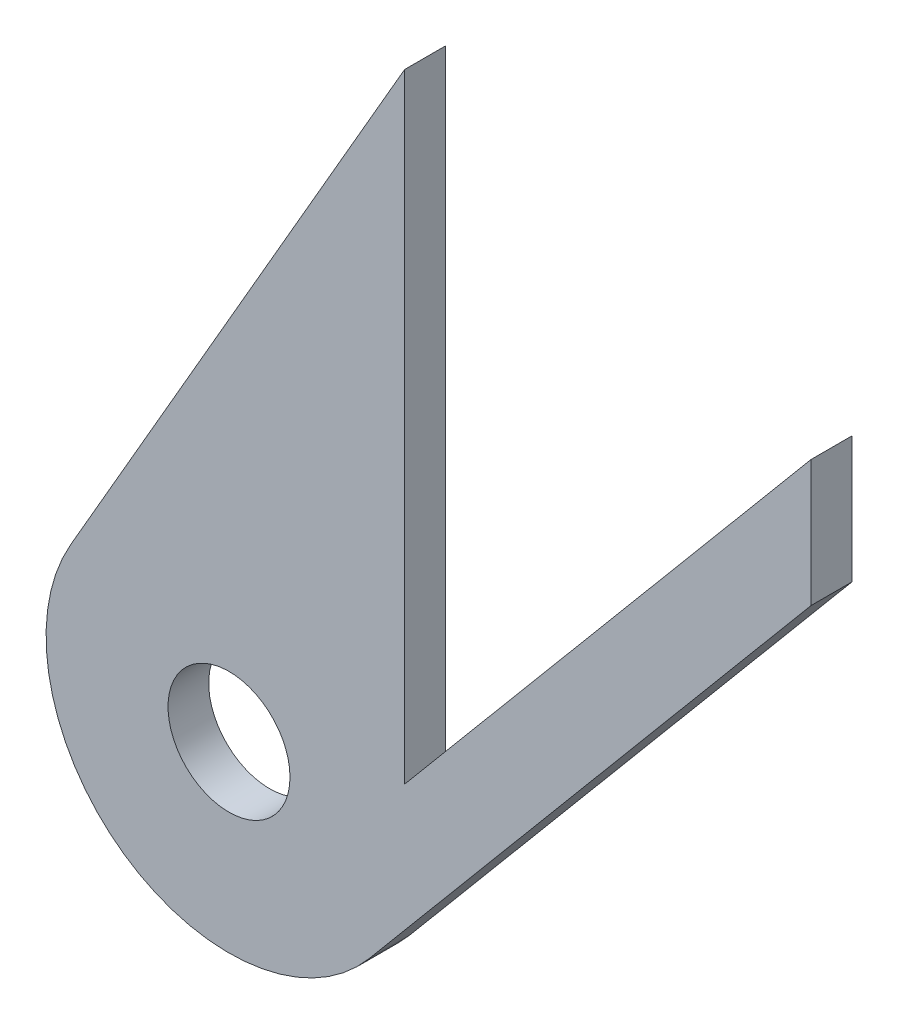
ISO-10303-21;
HEADER;
FILE_DESCRIPTION(('STEP AP214'),'2;1');
FILE_NAME('part.step','',(''),(''),'','','');
FILE_SCHEMA(('AUTOMOTIVE_DESIGN { 1 0 10303 214 1 1 1 1 }'));
ENDSEC;
DATA;
#1=APPLICATION_CONTEXT('core data for automotive mechanical design processes');
#2=APPLICATION_PROTOCOL_DEFINITION('international standard','automotive_design',2000,#1);
#3=PRODUCT_CONTEXT('',#1,'mechanical');
#4=PRODUCT('Part','Part','',(#3));
#5=PRODUCT_RELATED_PRODUCT_CATEGORY('part','',(#4));
#6=PRODUCT_DEFINITION_FORMATION('','',#4);
#7=PRODUCT_DEFINITION_CONTEXT('part definition',#1,'design');
#8=PRODUCT_DEFINITION('design','',#6,#7);
#9=PRODUCT_DEFINITION_SHAPE('','',#8);
#10=(LENGTH_UNIT() NAMED_UNIT(*) SI_UNIT(.MILLI.,.METRE.));
#11=(NAMED_UNIT(*) PLANE_ANGLE_UNIT() SI_UNIT($,.RADIAN.));
#12=(NAMED_UNIT(*) SI_UNIT($,.STERADIAN.) SOLID_ANGLE_UNIT());
#13=UNCERTAINTY_MEASURE_WITH_UNIT(LENGTH_MEASURE(1.E-05),#10,'distance_accuracy_value','');
#14=(GEOMETRIC_REPRESENTATION_CONTEXT(3) GLOBAL_UNCERTAINTY_ASSIGNED_CONTEXT((#13)) GLOBAL_UNIT_ASSIGNED_CONTEXT((#10,
#11,#12)) REPRESENTATION_CONTEXT('',''));
#15=CARTESIAN_POINT('',(0.,0.,0.));
#16=DIRECTION('',(0.,0.,1.));
#17=DIRECTION('',(1.,0.,0.));
#18=AXIS2_PLACEMENT_3D('',#15,#16,#17);
#19=CARTESIAN_POINT('',(0.,0.,10.));
#20=DIRECTION('',(0.,0.,1.));
#21=DIRECTION('',(1.,0.,0.));
#22=AXIS2_PLACEMENT_3D('',#19,#20,#21);
#23=PLANE('',#22);
#24=DIRECTION('',(0.,1.,0.));
#25=VECTOR('',#24,1.);
#26=CARTESIAN_POINT('',(43.2020211570784,12.5930682497693,10.));
#27=LINE('',#26,#25);
#28=CARTESIAN_POINT('',(43.2020211570784,12.5930682497693,10.));
#29=VERTEX_POINT('',#28);
#30=CARTESIAN_POINT('',(43.2020211570784,164.828095633725,10.));
#31=VERTEX_POINT('',#30);
#32=EDGE_CURVE('E129',#29,#31,#27,.T.);
#33=ORIENTED_EDGE('',*,*,#32,.T.);
#34=DIRECTION('',(-0.5,-0.866025403784439,0.));
#35=VECTOR('',#34,1.);
#36=CARTESIAN_POINT('',(-38.9711431702997,22.5,10.));
#37=LINE('',#36,#35);
#38=CARTESIAN_POINT('',(-38.9711431702997,22.5,10.));
#39=VERTEX_POINT('',#38);
#40=EDGE_CURVE('E87',#31,#39,#37,.T.);
#41=ORIENTED_EDGE('',*,*,#40,.T.);
#42=CARTESIAN_POINT('',(0.,0.,10.));
#43=DIRECTION('',(0.,0.,1.));
#44=DIRECTION('',(1.,0.,0.));
#45=AXIS2_PLACEMENT_3D('',#42,#43,#44);
#46=CIRCLE('',#45,45.);
#47=CARTESIAN_POINT('',(34.4719999403542,-28.925442435894,10.));
#48=VERTEX_POINT('',#47);
#49=EDGE_CURVE('E100',#39,#48,#46,.T.);
#50=ORIENTED_EDGE('',*,*,#49,.T.);
#51=DIRECTION('',(0.642787609686535,0.766044443118982,0.));
#52=VECTOR('',#51,1.);
#53=CARTESIAN_POINT('',(34.4719999403542,-28.925442435894,10.));
#54=LINE('',#53,#52);
#55=CARTESIAN_POINT('',(143.202021157079,100.653950971983,10.));
#56=VERTEX_POINT('',#55);
#57=EDGE_CURVE('E94',#48,#56,#54,.T.);
#58=ORIENTED_EDGE('',*,*,#57,.T.);
#59=DIRECTION('',(0.,1.,0.));
#60=VECTOR('',#59,1.);
#61=CARTESIAN_POINT('',(143.202021157079,100.653950971983,10.));
#62=LINE('',#61,#60);
#63=CARTESIAN_POINT('',(143.202021157079,131.768427509192,10.));
#64=VERTEX_POINT('',#63);
#65=EDGE_CURVE('E98',#56,#64,#62,.T.);
#66=ORIENTED_EDGE('',*,*,#65,.T.);
#67=DIRECTION('',(-0.642787609686535,-0.766044443118982,0.));
#68=VECTOR('',#67,1.);
#69=CARTESIAN_POINT('',(143.202021157079,131.768427509192,10.));
#70=LINE('',#69,#68);
#71=EDGE_CURVE('E50',#64,#29,#70,.T.);
#72=ORIENTED_EDGE('',*,*,#71,.T.);
#73=EDGE_LOOP('',(#33,#41,#50,#58,#66,#72));
#74=FACE_BOUND('',#73,.T.);
#75=CARTESIAN_POINT('',(0.,0.,10.));
#76=DIRECTION('',(0.,0.,1.));
#77=DIRECTION('',(1.,0.,0.));
#78=AXIS2_PLACEMENT_3D('',#75,#76,#77);
#79=CIRCLE('',#78,15.);
#80=CARTESIAN_POINT('',(15.,0.,10.));
#81=VERTEX_POINT('',#80);
#82=EDGE_CURVE('E122',#81,#81,#79,.T.);
#83=ORIENTED_EDGE('',*,*,#82,.F.);
#84=EDGE_LOOP('',(#83));
#85=FACE_BOUND('',#84,.T.);
#86=ADVANCED_FACE('F33',(#74,#85),#23,.T.);
#87=CARTESIAN_POINT('',(0.,0.,0.));
#88=DIRECTION('',(0.,0.,1.));
#89=DIRECTION('',(1.,0.,0.));
#90=AXIS2_PLACEMENT_3D('',#87,#88,#89);
#91=PLANE('',#90);
#92=DIRECTION('',(0.,1.,0.));
#93=VECTOR('',#92,1.);
#94=CARTESIAN_POINT('',(43.2020211570784,12.5930682497693,0.));
#95=LINE('',#94,#93);
#96=CARTESIAN_POINT('',(43.2020211570784,12.5930682497693,0.));
#97=VERTEX_POINT('',#96);
#98=CARTESIAN_POINT('',(43.2020211570784,164.828095633725,0.));
#99=VERTEX_POINT('',#98);
#100=EDGE_CURVE('E118',#97,#99,#95,.T.);
#101=ORIENTED_EDGE('',*,*,#100,.F.);
#102=DIRECTION('',(-0.642787609686535,-0.766044443118982,0.));
#103=VECTOR('',#102,1.);
#104=CARTESIAN_POINT('',(143.202021157079,131.768427509192,0.));
#105=LINE('',#104,#103);
#106=CARTESIAN_POINT('',(143.202021157079,131.768427509192,0.));
#107=VERTEX_POINT('',#106);
#108=EDGE_CURVE('E79',#107,#97,#105,.T.);
#109=ORIENTED_EDGE('',*,*,#108,.F.);
#110=DIRECTION('',(0.,1.,0.));
#111=VECTOR('',#110,1.);
#112=CARTESIAN_POINT('',(143.202021157079,100.653950971983,0.));
#113=LINE('',#112,#111);
#114=CARTESIAN_POINT('',(143.202021157079,100.653950971983,0.));
#115=VERTEX_POINT('',#114);
#116=EDGE_CURVE('E73',#115,#107,#113,.T.);
#117=ORIENTED_EDGE('',*,*,#116,.F.);
#118=DIRECTION('',(0.642787609686535,0.766044443118982,0.));
#119=VECTOR('',#118,1.);
#120=CARTESIAN_POINT('',(34.4719999403542,-28.925442435894,0.));
#121=LINE('',#120,#119);
#122=CARTESIAN_POINT('',(34.4719999403542,-28.925442435894,0.));
#123=VERTEX_POINT('',#122);
#124=EDGE_CURVE('E108',#123,#115,#121,.T.);
#125=ORIENTED_EDGE('',*,*,#124,.F.);
#126=CARTESIAN_POINT('',(0.,0.,0.));
#127=DIRECTION('',(0.,0.,1.));
#128=DIRECTION('',(1.,0.,0.));
#129=AXIS2_PLACEMENT_3D('',#126,#127,#128);
#130=CIRCLE('',#129,45.);
#131=CARTESIAN_POINT('',(-38.9711431702997,22.5,0.));
#132=VERTEX_POINT('',#131);
#133=EDGE_CURVE('E124',#132,#123,#130,.T.);
#134=ORIENTED_EDGE('',*,*,#133,.F.);
#135=DIRECTION('',(-0.5,-0.866025403784439,0.));
#136=VECTOR('',#135,1.);
#137=CARTESIAN_POINT('',(-38.9711431702997,22.5,0.));
#138=LINE('',#137,#136);
#139=EDGE_CURVE('E121',#99,#132,#138,.T.);
#140=ORIENTED_EDGE('',*,*,#139,.F.);
#141=EDGE_LOOP('',(#101,#109,#117,#125,#134,#140));
#142=FACE_BOUND('',#141,.T.);
#143=CARTESIAN_POINT('',(0.,0.,0.));
#144=DIRECTION('',(0.,0.,1.));
#145=DIRECTION('',(1.,0.,0.));
#146=AXIS2_PLACEMENT_3D('',#143,#144,#145);
#147=CIRCLE('',#146,15.);
#148=CARTESIAN_POINT('',(15.,0.,0.));
#149=VERTEX_POINT('',#148);
#150=EDGE_CURVE('E222',#149,#149,#147,.T.);
#151=ORIENTED_EDGE('',*,*,#150,.T.);
#152=EDGE_LOOP('',(#151));
#153=FACE_BOUND('',#152,.T.);
#154=ADVANCED_FACE('F138',(#142,#153),#91,.F.);
#155=CARTESIAN_POINT('',(43.2020211570784,12.5930682497693,10.));
#156=DIRECTION('',(-1.,0.,0.));
#157=DIRECTION('',(0.,0.,1.));
#158=AXIS2_PLACEMENT_3D('',#155,#156,#157);
#159=PLANE('',#158);
#160=ORIENTED_EDGE('',*,*,#100,.T.);
#161=DIRECTION('',(0.,0.,-1.));
#162=VECTOR('',#161,1.);
#163=CARTESIAN_POINT('',(43.2020211570784,164.828095633725,10.));
#164=LINE('',#163,#162);
#165=EDGE_CURVE('E11',#31,#99,#164,.T.);
#166=ORIENTED_EDGE('',*,*,#165,.F.);
#167=ORIENTED_EDGE('',*,*,#32,.F.);
#168=DIRECTION('',(0.,0.,-1.));
#169=VECTOR('',#168,1.);
#170=CARTESIAN_POINT('',(43.2020211570784,12.5930682497693,10.));
#171=LINE('',#170,#169);
#172=EDGE_CURVE('E114',#29,#97,#171,.T.);
#173=ORIENTED_EDGE('',*,*,#172,.T.);
#174=EDGE_LOOP('',(#160,#166,#167,#173));
#175=FACE_BOUND('',#174,.T.);
#176=ADVANCED_FACE('F35',(#175),#159,.F.);
#177=CARTESIAN_POINT('',(-38.9711431702997,22.5,10.));
#178=DIRECTION('',(0.866025403784439,-0.5,0.));
#179=DIRECTION('',(0.5,0.866025403784439,0.));
#180=AXIS2_PLACEMENT_3D('',#177,#178,#179);
#181=PLANE('',#180);
#182=ORIENTED_EDGE('',*,*,#139,.T.);
#183=DIRECTION('',(0.,0.,-1.));
#184=VECTOR('',#183,1.);
#185=CARTESIAN_POINT('',(-38.9711431702997,22.5,10.));
#186=LINE('',#185,#184);
#187=EDGE_CURVE('E42',#39,#132,#186,.T.);
#188=ORIENTED_EDGE('',*,*,#187,.F.);
#189=ORIENTED_EDGE('',*,*,#40,.F.);
#190=ORIENTED_EDGE('',*,*,#165,.T.);
#191=EDGE_LOOP('',(#182,#188,#189,#190));
#192=FACE_BOUND('',#191,.T.);
#193=ADVANCED_FACE('F163',(#192),#181,.F.);
#194=CARTESIAN_POINT('',(0.,0.,10.));
#195=DIRECTION('',(0.,0.,-1.));
#196=DIRECTION('',(-1.,0.,0.));
#197=AXIS2_PLACEMENT_3D('',#194,#195,#196);
#198=CYLINDRICAL_SURFACE('',#197,45.);
#199=ORIENTED_EDGE('',*,*,#133,.T.);
#200=DIRECTION('',(0.,0.,-1.));
#201=VECTOR('',#200,1.);
#202=CARTESIAN_POINT('',(34.4719999403542,-28.925442435894,10.));
#203=LINE('',#202,#201);
#204=EDGE_CURVE('E109',#48,#123,#203,.T.);
#205=ORIENTED_EDGE('',*,*,#204,.F.);
#206=ORIENTED_EDGE('',*,*,#49,.F.);
#207=ORIENTED_EDGE('',*,*,#187,.T.);
#208=EDGE_LOOP('',(#199,#205,#206,#207));
#209=FACE_BOUND('',#208,.T.);
#210=ADVANCED_FACE('F135',(#209),#198,.T.);
#211=CARTESIAN_POINT('',(34.4719999403542,-28.925442435894,10.));
#212=DIRECTION('',(-0.766044443118982,0.642787609686535,0.));
#213=DIRECTION('',(-0.642787609686535,-0.766044443118982,0.));
#214=AXIS2_PLACEMENT_3D('',#211,#212,#213);
#215=PLANE('',#214);
#216=ORIENTED_EDGE('',*,*,#124,.T.);
#217=DIRECTION('',(0.,0.,-1.));
#218=VECTOR('',#217,1.);
#219=CARTESIAN_POINT('',(143.202021157079,100.653950971983,10.));
#220=LINE('',#219,#218);
#221=EDGE_CURVE('E105',#56,#115,#220,.T.);
#222=ORIENTED_EDGE('',*,*,#221,.F.);
#223=ORIENTED_EDGE('',*,*,#57,.F.);
#224=ORIENTED_EDGE('',*,*,#204,.T.);
#225=EDGE_LOOP('',(#216,#222,#223,#224));
#226=FACE_BOUND('',#225,.T.);
#227=ADVANCED_FACE('F106',(#226),#215,.F.);
#228=CARTESIAN_POINT('',(143.202021157079,100.653950971983,10.));
#229=DIRECTION('',(-1.,0.,0.));
#230=DIRECTION('',(0.,0.,1.));
#231=AXIS2_PLACEMENT_3D('',#228,#229,#230);
#232=PLANE('',#231);
#233=ORIENTED_EDGE('',*,*,#116,.T.);
#234=DIRECTION('',(0.,0.,-1.));
#235=VECTOR('',#234,1.);
#236=CARTESIAN_POINT('',(143.202021157079,131.768427509192,10.));
#237=LINE('',#236,#235);
#238=EDGE_CURVE('E110',#64,#107,#237,.T.);
#239=ORIENTED_EDGE('',*,*,#238,.F.);
#240=ORIENTED_EDGE('',*,*,#65,.F.);
#241=ORIENTED_EDGE('',*,*,#221,.T.);
#242=EDGE_LOOP('',(#233,#239,#240,#241));
#243=FACE_BOUND('',#242,.T.);
#244=ADVANCED_FACE('F112',(#243),#232,.F.);
#245=CARTESIAN_POINT('',(143.202021157079,131.768427509192,10.));
#246=DIRECTION('',(0.766044443118982,-0.642787609686535,0.));
#247=DIRECTION('',(0.642787609686535,0.766044443118982,0.));
#248=AXIS2_PLACEMENT_3D('',#245,#246,#247);
#249=PLANE('',#248);
#250=ORIENTED_EDGE('',*,*,#108,.T.);
#251=ORIENTED_EDGE('',*,*,#172,.F.);
#252=ORIENTED_EDGE('',*,*,#71,.F.);
#253=ORIENTED_EDGE('',*,*,#238,.T.);
#254=EDGE_LOOP('',(#250,#251,#252,#253));
#255=FACE_BOUND('',#254,.T.);
#256=ADVANCED_FACE('F143',(#255),#249,.F.);
#257=CARTESIAN_POINT('',(0.,0.,10.));
#258=DIRECTION('',(0.,0.,-1.));
#259=DIRECTION('',(-1.,0.,0.));
#260=AXIS2_PLACEMENT_3D('',#257,#258,#259);
#261=CYLINDRICAL_SURFACE('',#260,15.);
#262=ORIENTED_EDGE('',*,*,#82,.T.);
#263=EDGE_LOOP('',(#262));
#264=FACE_BOUND('',#263,.T.);
#265=ORIENTED_EDGE('',*,*,#150,.F.);
#266=EDGE_LOOP('',(#265));
#267=FACE_BOUND('',#266,.T.);
#268=ADVANCED_FACE('F145',(#264,#267),#261,.F.);
#269=CLOSED_SHELL('',(#86,#154,#176,#193,#210,#227,#244,#256,#268));
#270=MANIFOLD_SOLID_BREP('B2',#269);
#271=ADVANCED_BREP_SHAPE_REPRESENTATION('',(#18,#270),#14);
#272=SHAPE_DEFINITION_REPRESENTATION(#9,#271);
ENDSEC;
END-ISO-10303-21;
